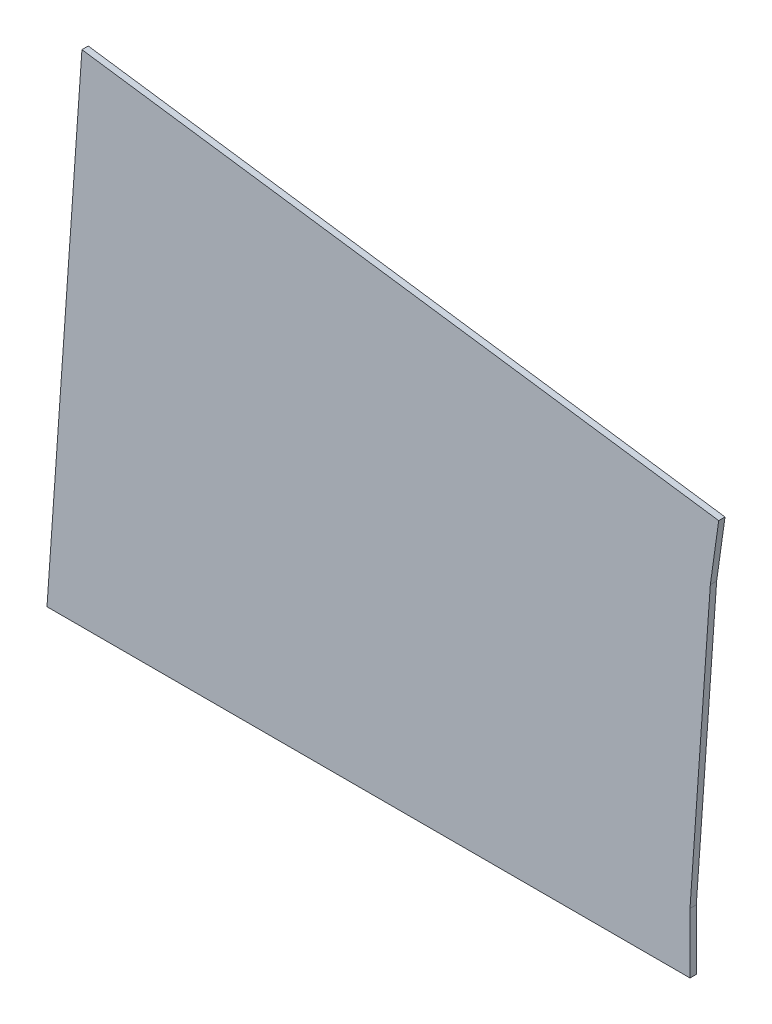
ISO-10303-21;
HEADER;
FILE_DESCRIPTION(('STEP AP214'),'2;1');
FILE_NAME('part.step','',(''),(''),'','','');
FILE_SCHEMA(('AUTOMOTIVE_DESIGN { 1 0 10303 214 1 1 1 1 }'));
ENDSEC;
DATA;
#1=APPLICATION_CONTEXT('core data for automotive mechanical design processes');
#2=APPLICATION_PROTOCOL_DEFINITION('international standard','automotive_design',2000,#1);
#3=PRODUCT_CONTEXT('',#1,'mechanical');
#4=PRODUCT('Part','Part','',(#3));
#5=PRODUCT_RELATED_PRODUCT_CATEGORY('part','',(#4));
#6=PRODUCT_DEFINITION_FORMATION('','',#4);
#7=PRODUCT_DEFINITION_CONTEXT('part definition',#1,'design');
#8=PRODUCT_DEFINITION('design','',#6,#7);
#9=PRODUCT_DEFINITION_SHAPE('','',#8);
#10=(LENGTH_UNIT() NAMED_UNIT(*) SI_UNIT(.MILLI.,.METRE.));
#11=(NAMED_UNIT(*) PLANE_ANGLE_UNIT() SI_UNIT($,.RADIAN.));
#12=(NAMED_UNIT(*) SI_UNIT($,.STERADIAN.) SOLID_ANGLE_UNIT());
#13=UNCERTAINTY_MEASURE_WITH_UNIT(LENGTH_MEASURE(1.E-05),#10,'distance_accuracy_value','');
#14=(GEOMETRIC_REPRESENTATION_CONTEXT(3) GLOBAL_UNCERTAINTY_ASSIGNED_CONTEXT((#13)) GLOBAL_UNIT_ASSIGNED_CONTEXT((#10,
#11,#12)) REPRESENTATION_CONTEXT('',''));
#15=CARTESIAN_POINT('',(0.,0.,0.));
#16=DIRECTION('',(0.,0.,1.));
#17=DIRECTION('',(1.,0.,0.));
#18=AXIS2_PLACEMENT_3D('',#15,#16,#17);
#19=CARTESIAN_POINT('',(-103.336989563686,-9.52500000000001,2.));
#20=DIRECTION('',(0.,1.,0.));
#21=DIRECTION('',(0.,0.,1.));
#22=AXIS2_PLACEMENT_3D('',#19,#20,#21);
#23=PLANE('',#22);
#24=DIRECTION('',(1.,0.,0.));
#25=VECTOR('',#24,1.);
#26=CARTESIAN_POINT('',(-103.336989563686,-9.52500000000001,0.));
#27=LINE('',#26,#25);
#28=CARTESIAN_POINT('',(-103.336989563686,-9.52500000000001,0.));
#29=VERTEX_POINT('',#28);
#30=CARTESIAN_POINT('',(100.000000000002,-9.52500000000001,0.));
#31=VERTEX_POINT('',#30);
#32=EDGE_CURVE('E117',#29,#31,#27,.T.);
#33=ORIENTED_EDGE('',*,*,#32,.T.);
#34=DIRECTION('',(0.,0.,-1.));
#35=VECTOR('',#34,1.);
#36=CARTESIAN_POINT('',(100.000000000002,-9.52500000000001,2.));
#37=LINE('',#36,#35);
#38=CARTESIAN_POINT('',(100.000000000002,-9.52500000000001,2.));
#39=VERTEX_POINT('',#38);
#40=EDGE_CURVE('E11',#39,#31,#37,.T.);
#41=ORIENTED_EDGE('',*,*,#40,.F.);
#42=DIRECTION('',(1.,0.,0.));
#43=VECTOR('',#42,1.);
#44=CARTESIAN_POINT('',(-103.336989563686,-9.52500000000001,2.));
#45=LINE('',#44,#43);
#46=CARTESIAN_POINT('',(-103.336989563686,-9.52500000000001,2.));
#47=VERTEX_POINT('',#46);
#48=EDGE_CURVE('E127',#47,#39,#45,.T.);
#49=ORIENTED_EDGE('',*,*,#48,.F.);
#50=DIRECTION('',(0.,0.,-1.));
#51=VECTOR('',#50,1.);
#52=CARTESIAN_POINT('',(-103.336989563686,-9.52500000000001,2.));
#53=LINE('',#52,#51);
#54=EDGE_CURVE('E113',#47,#29,#53,.T.);
#55=ORIENTED_EDGE('',*,*,#54,.T.);
#56=EDGE_LOOP('',(#33,#41,#49,#55));
#57=FACE_BOUND('',#56,.T.);
#58=ADVANCED_FACE('F33',(#57),#23,.F.);
#59=CARTESIAN_POINT('',(100.000000000002,-9.52500000000001,2.));
#60=DIRECTION('',(-1.,0.,0.));
#61=DIRECTION('',(0.,-1.,0.));
#62=AXIS2_PLACEMENT_3D('',#59,#60,#61);
#63=PLANE('',#62);
#64=DIRECTION('',(0.,1.,0.));
#65=VECTOR('',#64,1.);
#66=CARTESIAN_POINT('',(100.000000000002,-9.52500000000001,0.));
#67=LINE('',#66,#65);
#68=CARTESIAN_POINT('',(100.000000000002,9.525,0.));
#69=VERTEX_POINT('',#68);
#70=EDGE_CURVE('E120',#31,#69,#67,.T.);
#71=ORIENTED_EDGE('',*,*,#70,.T.);
#72=DIRECTION('',(0.,0.,-1.));
#73=VECTOR('',#72,1.);
#74=CARTESIAN_POINT('',(100.000000000002,9.525,2.));
#75=LINE('',#74,#73);
#76=CARTESIAN_POINT('',(100.000000000002,9.525,2.));
#77=VERTEX_POINT('',#76);
#78=EDGE_CURVE('E41',#77,#69,#75,.T.);
#79=ORIENTED_EDGE('',*,*,#78,.F.);
#80=DIRECTION('',(0.,1.,0.));
#81=VECTOR('',#80,1.);
#82=CARTESIAN_POINT('',(100.000000000002,-9.52500000000001,2.));
#83=LINE('',#82,#81);
#84=EDGE_CURVE('E86',#39,#77,#83,.T.);
#85=ORIENTED_EDGE('',*,*,#84,.F.);
#86=ORIENTED_EDGE('',*,*,#40,.T.);
#87=EDGE_LOOP('',(#71,#79,#85,#86));
#88=FACE_BOUND('',#87,.T.);
#89=ADVANCED_FACE('F151',(#88),#63,.F.);
#90=CARTESIAN_POINT('',(100.000000000002,9.525,2.));
#91=DIRECTION('',(-0.997564050259825,0.0697564737441185,0.));
#92=DIRECTION('',(-0.0697564737441185,-0.997564050259825,0.));
#93=AXIS2_PLACEMENT_3D('',#90,#91,#92);
#94=PLANE('',#93);
#95=DIRECTION('',(0.0697564737441185,0.997564050259825,0.));
#96=VECTOR('',#95,1.);
#97=CARTESIAN_POINT('',(100.000000000002,9.525,0.));
#98=LINE('',#97,#96);
#99=CARTESIAN_POINT('',(106.424390597611,101.398065839168,0.));
#100=VERTEX_POINT('',#99);
#101=EDGE_CURVE('E122',#69,#100,#98,.T.);
#102=ORIENTED_EDGE('',*,*,#101,.T.);
#103=DIRECTION('',(0.,0.,-1.));
#104=VECTOR('',#103,1.);
#105=CARTESIAN_POINT('',(106.424390597611,101.398065839168,2.));
#106=LINE('',#105,#104);
#107=CARTESIAN_POINT('',(106.424390597611,101.398065839168,2.));
#108=VERTEX_POINT('',#107);
#109=EDGE_CURVE('E108',#108,#100,#106,.T.);
#110=ORIENTED_EDGE('',*,*,#109,.F.);
#111=DIRECTION('',(0.0697564737441185,0.997564050259825,0.));
#112=VECTOR('',#111,1.);
#113=CARTESIAN_POINT('',(100.000000000002,9.525,2.));
#114=LINE('',#113,#112);
#115=EDGE_CURVE('E99',#77,#108,#114,.T.);
#116=ORIENTED_EDGE('',*,*,#115,.F.);
#117=ORIENTED_EDGE('',*,*,#78,.T.);
#118=EDGE_LOOP('',(#102,#110,#116,#117));
#119=FACE_BOUND('',#118,.T.);
#120=ADVANCED_FACE('F133',(#119),#94,.F.);
#121=CARTESIAN_POINT('',(106.424390597611,101.398065839168,2.));
#122=DIRECTION('',(-0.990268068741572,0.139173100960051,0.));
#123=DIRECTION('',(-0.139173100960051,-0.990268068741572,0.));
#124=AXIS2_PLACEMENT_3D('',#121,#122,#123);
#125=PLANE('',#124);
#126=DIRECTION('',(0.139173100960051,0.990268068741572,0.));
#127=VECTOR('',#126,1.);
#128=CARTESIAN_POINT('',(106.424390597611,101.398065839168,0.));
#129=LINE('',#128,#127);
#130=CARTESIAN_POINT('',(109.0756381709,120.262672548695,0.));
#131=VERTEX_POINT('',#130);
#132=EDGE_CURVE('E107',#100,#131,#129,.T.);
#133=ORIENTED_EDGE('',*,*,#132,.T.);
#134=DIRECTION('',(0.,0.,-1.));
#135=VECTOR('',#134,1.);
#136=CARTESIAN_POINT('',(109.0756381709,120.262672548695,2.));
#137=LINE('',#136,#135);
#138=CARTESIAN_POINT('',(109.0756381709,120.262672548695,2.));
#139=VERTEX_POINT('',#138);
#140=EDGE_CURVE('E104',#139,#131,#137,.T.);
#141=ORIENTED_EDGE('',*,*,#140,.F.);
#142=DIRECTION('',(0.139173100960051,0.990268068741572,0.));
#143=VECTOR('',#142,1.);
#144=CARTESIAN_POINT('',(106.424390597611,101.398065839168,2.));
#145=LINE('',#144,#143);
#146=EDGE_CURVE('E93',#108,#139,#145,.T.);
#147=ORIENTED_EDGE('',*,*,#146,.F.);
#148=ORIENTED_EDGE('',*,*,#109,.T.);
#149=EDGE_LOOP('',(#133,#141,#147,#148));
#150=FACE_BOUND('',#149,.T.);
#151=ADVANCED_FACE('F105',(#150),#125,.F.);
#152=CARTESIAN_POINT('',(109.0756381709,120.262672548695,2.));
#153=DIRECTION('',(-0.139173100960051,-0.990268068741572,0.));
#154=DIRECTION('',(0.990268068741572,-0.139173100960051,0.));
#155=AXIS2_PLACEMENT_3D('',#152,#153,#154);
#156=PLANE('',#155);
#157=DIRECTION('',(-0.990268068741572,0.139173100960051,0.));
#158=VECTOR('',#157,1.);
#159=CARTESIAN_POINT('',(109.0756381709,120.262672548695,0.));
#160=LINE('',#159,#158);
#161=CARTESIAN_POINT('',(-92.282489788059,148.561711926155,0.));
#162=VERTEX_POINT('',#161);
#163=EDGE_CURVE('E72',#131,#162,#160,.T.);
#164=ORIENTED_EDGE('',*,*,#163,.T.);
#165=DIRECTION('',(0.,0.,-1.));
#166=VECTOR('',#165,1.);
#167=CARTESIAN_POINT('',(-92.282489788059,148.561711926155,2.));
#168=LINE('',#167,#166);
#169=CARTESIAN_POINT('',(-92.282489788059,148.561711926155,2.));
#170=VERTEX_POINT('',#169);
#171=EDGE_CURVE('E109',#170,#162,#168,.T.);
#172=ORIENTED_EDGE('',*,*,#171,.F.);
#173=DIRECTION('',(-0.990268068741572,0.139173100960051,0.));
#174=VECTOR('',#173,1.);
#175=CARTESIAN_POINT('',(109.0756381709,120.262672548695,2.));
#176=LINE('',#175,#174);
#177=EDGE_CURVE('E97',#139,#170,#176,.T.);
#178=ORIENTED_EDGE('',*,*,#177,.F.);
#179=ORIENTED_EDGE('',*,*,#140,.T.);
#180=EDGE_LOOP('',(#164,#172,#178,#179));
#181=FACE_BOUND('',#180,.T.);
#182=ADVANCED_FACE('F111',(#181),#156,.F.);
#183=CARTESIAN_POINT('',(-92.282489788059,148.561711926155,2.));
#184=DIRECTION('',(0.997564050259825,-0.0697564737441185,0.));
#185=DIRECTION('',(0.0697564737441185,0.997564050259825,0.));
#186=AXIS2_PLACEMENT_3D('',#183,#184,#185);
#187=PLANE('',#186);
#188=DIRECTION('',(-0.0697564737441184,-0.997564050259825,0.));
#189=VECTOR('',#188,1.);
#190=CARTESIAN_POINT('',(-92.282489788059,148.561711926155,0.));
#191=LINE('',#190,#189);
#192=EDGE_CURVE('E78',#162,#29,#191,.T.);
#193=ORIENTED_EDGE('',*,*,#192,.T.);
#194=ORIENTED_EDGE('',*,*,#54,.F.);
#195=DIRECTION('',(-0.0697564737441184,-0.997564050259825,0.));
#196=VECTOR('',#195,1.);
#197=CARTESIAN_POINT('',(-92.282489788059,148.561711926155,2.));
#198=LINE('',#197,#196);
#199=EDGE_CURVE('E49',#170,#47,#198,.T.);
#200=ORIENTED_EDGE('',*,*,#199,.F.);
#201=ORIENTED_EDGE('',*,*,#171,.T.);
#202=EDGE_LOOP('',(#193,#194,#200,#201));
#203=FACE_BOUND('',#202,.T.);
#204=ADVANCED_FACE('F140',(#203),#187,.F.);
#205=CARTESIAN_POINT('',(0.,0.,2.));
#206=DIRECTION('',(0.,0.,1.));
#207=DIRECTION('',(1.,0.,0.));
#208=AXIS2_PLACEMENT_3D('',#205,#206,#207);
#209=PLANE('',#208);
#210=ORIENTED_EDGE('',*,*,#48,.T.);
#211=ORIENTED_EDGE('',*,*,#84,.T.);
#212=ORIENTED_EDGE('',*,*,#115,.T.);
#213=ORIENTED_EDGE('',*,*,#146,.T.);
#214=ORIENTED_EDGE('',*,*,#177,.T.);
#215=ORIENTED_EDGE('',*,*,#199,.T.);
#216=EDGE_LOOP('',(#210,#211,#212,#213,#214,#215));
#217=FACE_BOUND('',#216,.T.);
#218=ADVANCED_FACE('F95',(#217),#209,.T.);
#219=CARTESIAN_POINT('',(0.,0.,0.));
#220=DIRECTION('',(0.,0.,1.));
#221=DIRECTION('',(1.,0.,0.));
#222=AXIS2_PLACEMENT_3D('',#219,#220,#221);
#223=PLANE('',#222);
#224=ORIENTED_EDGE('',*,*,#32,.F.);
#225=ORIENTED_EDGE('',*,*,#192,.F.);
#226=ORIENTED_EDGE('',*,*,#163,.F.);
#227=ORIENTED_EDGE('',*,*,#132,.F.);
#228=ORIENTED_EDGE('',*,*,#101,.F.);
#229=ORIENTED_EDGE('',*,*,#70,.F.);
#230=EDGE_LOOP('',(#224,#225,#226,#227,#228,#229));
#231=FACE_BOUND('',#230,.T.);
#232=ADVANCED_FACE('F136',(#231),#223,.F.);
#233=CLOSED_SHELL('',(#58,#89,#120,#151,#182,#204,#218,#232));
#234=MANIFOLD_SOLID_BREP('B2',#233);
#235=ADVANCED_BREP_SHAPE_REPRESENTATION('',(#18,#234),#14);
#236=SHAPE_DEFINITION_REPRESENTATION(#9,#235);
ENDSEC;
END-ISO-10303-21;
